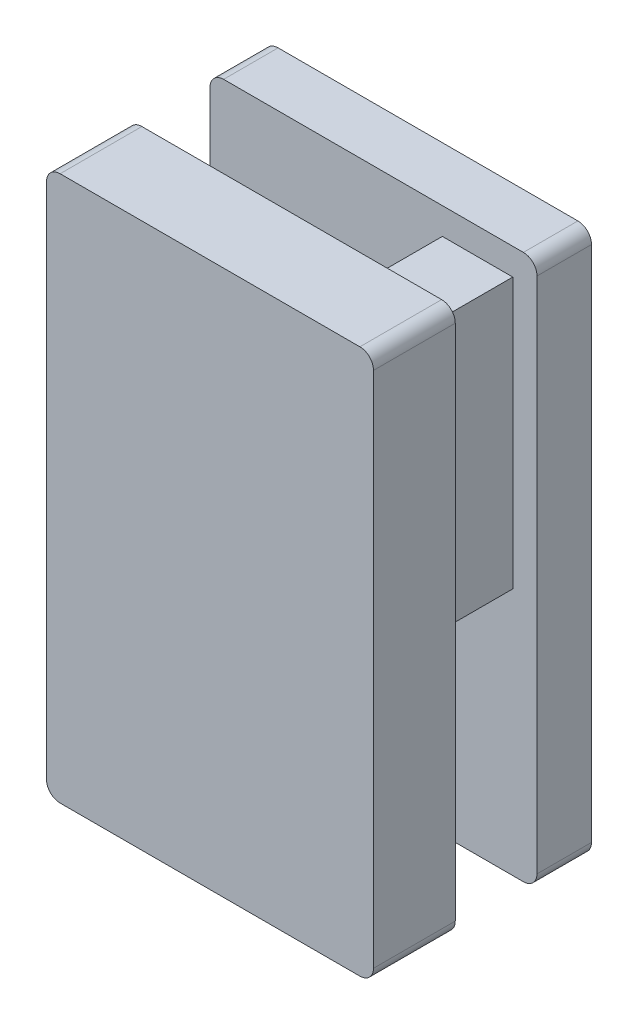
ISO-10303-21;
HEADER;
FILE_DESCRIPTION(('STEP AP214'),'2;1');
FILE_NAME('part.step','',(''),(''),'','','');
FILE_SCHEMA(('AUTOMOTIVE_DESIGN { 1 0 10303 214 1 1 1 1 }'));
ENDSEC;
DATA;
#1=APPLICATION_CONTEXT('core data for automotive mechanical design processes');
#2=APPLICATION_PROTOCOL_DEFINITION('international standard','automotive_design',2000,#1);
#3=PRODUCT_CONTEXT('',#1,'mechanical');
#4=PRODUCT('Part','Part','',(#3));
#5=PRODUCT_RELATED_PRODUCT_CATEGORY('part','',(#4));
#6=PRODUCT_DEFINITION_FORMATION('','',#4);
#7=PRODUCT_DEFINITION_CONTEXT('part definition',#1,'design');
#8=PRODUCT_DEFINITION('design','',#6,#7);
#9=PRODUCT_DEFINITION_SHAPE('','',#8);
#10=(LENGTH_UNIT() NAMED_UNIT(*) SI_UNIT(.MILLI.,.METRE.));
#11=(NAMED_UNIT(*) PLANE_ANGLE_UNIT() SI_UNIT($,.RADIAN.));
#12=(NAMED_UNIT(*) SI_UNIT($,.STERADIAN.) SOLID_ANGLE_UNIT());
#13=UNCERTAINTY_MEASURE_WITH_UNIT(LENGTH_MEASURE(1.E-05),#10,'distance_accuracy_value','');
#14=(GEOMETRIC_REPRESENTATION_CONTEXT(3) GLOBAL_UNCERTAINTY_ASSIGNED_CONTEXT((#13)) GLOBAL_UNIT_ASSIGNED_CONTEXT((#10,
#11,#12)) REPRESENTATION_CONTEXT('',''));
#15=CARTESIAN_POINT('',(0.,0.,0.));
#16=DIRECTION('',(0.,0.,1.));
#17=DIRECTION('',(1.,0.,0.));
#18=AXIS2_PLACEMENT_3D('',#15,#16,#17);
#19=CARTESIAN_POINT('',(0.,0.,2.));
#20=DIRECTION('',(0.,0.,1.));
#21=DIRECTION('',(1.,0.,0.));
#22=AXIS2_PLACEMENT_3D('',#19,#20,#21);
#23=PLANE('',#22);
#24=DIRECTION('',(0.,1.,0.));
#25=VECTOR('',#24,1.);
#26=CARTESIAN_POINT('',(74.5858711935382,-153.,2.));
#27=LINE('',#26,#25);
#28=CARTESIAN_POINT('',(74.5858711935382,-172.5,2.));
#29=VERTEX_POINT('',#28);
#30=CARTESIAN_POINT('',(74.5858711935382,-153.5,2.));
#31=VERTEX_POINT('',#30);
#32=EDGE_CURVE('E218',#29,#31,#27,.T.);
#33=ORIENTED_EDGE('',*,*,#32,.T.);
#34=CARTESIAN_POINT('',(74.0858711935382,-153.5,2.));
#35=DIRECTION('',(0.,0.,1.));
#36=DIRECTION('',(1.,0.,0.));
#37=AXIS2_PLACEMENT_3D('',#34,#35,#36);
#38=CIRCLE('',#37,0.5);
#39=CARTESIAN_POINT('',(74.0858711935382,-153.,2.));
#40=VERTEX_POINT('',#39);
#41=EDGE_CURVE('E282',#31,#40,#38,.T.);
#42=ORIENTED_EDGE('',*,*,#41,.T.);
#43=DIRECTION('',(-1.,0.,0.));
#44=VECTOR('',#43,1.);
#45=CARTESIAN_POINT('',(62.5858711935382,-153.,2.));
#46=LINE('',#45,#44);
#47=CARTESIAN_POINT('',(63.0858711935382,-153.,2.));
#48=VERTEX_POINT('',#47);
#49=EDGE_CURVE('E221',#40,#48,#46,.T.);
#50=ORIENTED_EDGE('',*,*,#49,.T.);
#51=CARTESIAN_POINT('',(63.0858711935382,-153.5,2.));
#52=DIRECTION('',(0.,0.,1.));
#53=DIRECTION('',(1.,0.,0.));
#54=AXIS2_PLACEMENT_3D('',#51,#52,#53);
#55=CIRCLE('',#54,0.5);
#56=CARTESIAN_POINT('',(62.5858711935382,-153.5,2.));
#57=VERTEX_POINT('',#56);
#58=EDGE_CURVE('E280',#48,#57,#55,.T.);
#59=ORIENTED_EDGE('',*,*,#58,.T.);
#60=DIRECTION('',(0.,-1.,0.));
#61=VECTOR('',#60,1.);
#62=CARTESIAN_POINT('',(62.5858711935382,-153.,2.));
#63=LINE('',#62,#61);
#64=CARTESIAN_POINT('',(62.5858711935382,-172.5,2.));
#65=VERTEX_POINT('',#64);
#66=EDGE_CURVE('E213',#57,#65,#63,.T.);
#67=ORIENTED_EDGE('',*,*,#66,.T.);
#68=CARTESIAN_POINT('',(63.0858711935382,-172.5,2.));
#69=DIRECTION('',(0.,0.,1.));
#70=DIRECTION('',(1.,0.,0.));
#71=AXIS2_PLACEMENT_3D('',#68,#69,#70);
#72=CIRCLE('',#71,0.5);
#73=CARTESIAN_POINT('',(63.0858711935382,-173.,2.));
#74=VERTEX_POINT('',#73);
#75=EDGE_CURVE('E52',#65,#74,#72,.T.);
#76=ORIENTED_EDGE('',*,*,#75,.T.);
#77=DIRECTION('',(1.,0.,0.));
#78=VECTOR('',#77,1.);
#79=CARTESIAN_POINT('',(62.5858711935382,-173.,2.));
#80=LINE('',#79,#78);
#81=CARTESIAN_POINT('',(74.0858711935382,-173.,2.));
#82=VERTEX_POINT('',#81);
#83=EDGE_CURVE('E215',#74,#82,#80,.T.);
#84=ORIENTED_EDGE('',*,*,#83,.T.);
#85=CARTESIAN_POINT('',(74.0858711935382,-172.5,2.));
#86=DIRECTION('',(0.,0.,1.));
#87=DIRECTION('',(1.,0.,0.));
#88=AXIS2_PLACEMENT_3D('',#85,#86,#87);
#89=CIRCLE('',#88,0.5);
#90=EDGE_CURVE('E278',#82,#29,#89,.T.);
#91=ORIENTED_EDGE('',*,*,#90,.T.);
#92=EDGE_LOOP('',(#33,#42,#50,#59,#67,#76,#84,#91));
#93=FACE_BOUND('',#92,.T.);
#94=DIRECTION('',(-1.,0.,0.));
#95=VECTOR('',#94,1.);
#96=CARTESIAN_POINT('',(73.6964382759244,-153.978446212882,2.));
#97=LINE('',#96,#95);
#98=CARTESIAN_POINT('',(73.6964382759244,-153.978446212882,2.));
#99=VERTEX_POINT('',#98);
#100=CARTESIAN_POINT('',(71.1128246922588,-153.978446212882,2.));
#101=VERTEX_POINT('',#100);
#102=EDGE_CURVE('E200',#99,#101,#97,.T.);
#103=ORIENTED_EDGE('',*,*,#102,.F.);
#104=DIRECTION('',(0.,1.,0.));
#105=VECTOR('',#104,1.);
#106=CARTESIAN_POINT('',(73.6964382759244,-153.978446212882,2.));
#107=LINE('',#106,#105);
#108=CARTESIAN_POINT('',(73.6964382759244,-163.88819694475,2.));
#109=VERTEX_POINT('',#108);
#110=EDGE_CURVE('E198',#109,#99,#107,.T.);
#111=ORIENTED_EDGE('',*,*,#110,.F.);
#112=DIRECTION('',(1.,0.,0.));
#113=VECTOR('',#112,1.);
#114=CARTESIAN_POINT('',(73.6964382759244,-163.88819694475,2.));
#115=LINE('',#114,#113);
#116=CARTESIAN_POINT('',(71.1128246922588,-163.88819694475,2.));
#117=VERTEX_POINT('',#116);
#118=EDGE_CURVE('E181',#117,#109,#115,.T.);
#119=ORIENTED_EDGE('',*,*,#118,.F.);
#120=DIRECTION('',(0.,-1.,0.));
#121=VECTOR('',#120,1.);
#122=CARTESIAN_POINT('',(71.1128246922588,-153.978446212882,2.));
#123=LINE('',#122,#121);
#124=EDGE_CURVE('E203',#101,#117,#123,.T.);
#125=ORIENTED_EDGE('',*,*,#124,.F.);
#126=EDGE_LOOP('',(#103,#111,#119,#125));
#127=FACE_BOUND('',#126,.T.);
#128=ADVANCED_FACE('F32',(#93,#127),#23,.T.);
#129=CARTESIAN_POINT('',(62.5858711935382,-153.,2.));
#130=DIRECTION('',(1.,0.,0.));
#131=DIRECTION('',(0.,0.,-1.));
#132=AXIS2_PLACEMENT_3D('',#129,#130,#131);
#133=PLANE('',#132);
#134=ORIENTED_EDGE('',*,*,#66,.F.);
#135=DIRECTION('',(0.,0.,-1.));
#136=VECTOR('',#135,1.);
#137=CARTESIAN_POINT('',(62.5858711935382,-153.5,2.));
#138=LINE('',#137,#136);
#139=CARTESIAN_POINT('',(62.5858711935382,-153.5,0.));
#140=VERTEX_POINT('',#139);
#141=EDGE_CURVE('E291',#57,#140,#138,.T.);
#142=ORIENTED_EDGE('',*,*,#141,.T.);
#143=DIRECTION('',(0.,-1.,0.));
#144=VECTOR('',#143,1.);
#145=CARTESIAN_POINT('',(62.5858711935382,-153.,0.));
#146=LINE('',#145,#144);
#147=CARTESIAN_POINT('',(62.5858711935382,-172.5,0.));
#148=VERTEX_POINT('',#147);
#149=EDGE_CURVE('E212',#140,#148,#146,.T.);
#150=ORIENTED_EDGE('',*,*,#149,.T.);
#151=DIRECTION('',(0.,0.,-1.));
#152=VECTOR('',#151,1.);
#153=CARTESIAN_POINT('',(62.5858711935382,-172.5,2.));
#154=LINE('',#153,#152);
#155=EDGE_CURVE('E289',#148,#65,#154,.F.);
#156=ORIENTED_EDGE('',*,*,#155,.T.);
#157=EDGE_LOOP('',(#134,#142,#150,#156));
#158=FACE_BOUND('',#157,.T.);
#159=ADVANCED_FACE('F331',(#158),#133,.F.);
#160=CARTESIAN_POINT('',(62.5858711935382,-173.,2.));
#161=DIRECTION('',(0.,1.,0.));
#162=DIRECTION('',(0.,0.,1.));
#163=AXIS2_PLACEMENT_3D('',#160,#161,#162);
#164=PLANE('',#163);
#165=DIRECTION('',(1.,0.,0.));
#166=VECTOR('',#165,1.);
#167=CARTESIAN_POINT('',(62.5858711935382,-173.,0.));
#168=LINE('',#167,#166);
#169=CARTESIAN_POINT('',(63.0858711935382,-173.,0.));
#170=VERTEX_POINT('',#169);
#171=CARTESIAN_POINT('',(74.0858711935382,-173.,0.));
#172=VERTEX_POINT('',#171);
#173=EDGE_CURVE('E227',#170,#172,#168,.T.);
#174=ORIENTED_EDGE('',*,*,#173,.T.);
#175=DIRECTION('',(0.,0.,-1.));
#176=VECTOR('',#175,1.);
#177=CARTESIAN_POINT('',(74.0858711935382,-173.,2.));
#178=LINE('',#177,#176);
#179=EDGE_CURVE('E11',#172,#82,#178,.F.);
#180=ORIENTED_EDGE('',*,*,#179,.T.);
#181=ORIENTED_EDGE('',*,*,#83,.F.);
#182=DIRECTION('',(0.,0.,-1.));
#183=VECTOR('',#182,1.);
#184=CARTESIAN_POINT('',(63.0858711935382,-173.,2.));
#185=LINE('',#184,#183);
#186=EDGE_CURVE('E40',#74,#170,#185,.T.);
#187=ORIENTED_EDGE('',*,*,#186,.T.);
#188=EDGE_LOOP('',(#174,#180,#181,#187));
#189=FACE_BOUND('',#188,.T.);
#190=ADVANCED_FACE('F301',(#189),#164,.F.);
#191=CARTESIAN_POINT('',(74.5858711935382,-153.,2.));
#192=DIRECTION('',(-1.,0.,0.));
#193=DIRECTION('',(0.,0.,1.));
#194=AXIS2_PLACEMENT_3D('',#191,#192,#193);
#195=PLANE('',#194);
#196=DIRECTION('',(0.,1.,0.));
#197=VECTOR('',#196,1.);
#198=CARTESIAN_POINT('',(74.5858711935382,-153.,0.));
#199=LINE('',#198,#197);
#200=CARTESIAN_POINT('',(74.5858711935382,-172.5,0.));
#201=VERTEX_POINT('',#200);
#202=CARTESIAN_POINT('',(74.5858711935382,-153.5,0.));
#203=VERTEX_POINT('',#202);
#204=EDGE_CURVE('E229',#201,#203,#199,.T.);
#205=ORIENTED_EDGE('',*,*,#204,.T.);
#206=DIRECTION('',(0.,0.,-1.));
#207=VECTOR('',#206,1.);
#208=CARTESIAN_POINT('',(74.5858711935382,-153.5,2.));
#209=LINE('',#208,#207);
#210=EDGE_CURVE('E275',#203,#31,#209,.F.);
#211=ORIENTED_EDGE('',*,*,#210,.T.);
#212=ORIENTED_EDGE('',*,*,#32,.F.);
#213=DIRECTION('',(0.,0.,-1.));
#214=VECTOR('',#213,1.);
#215=CARTESIAN_POINT('',(74.5858711935382,-172.5,2.));
#216=LINE('',#215,#214);
#217=EDGE_CURVE('E272',#29,#201,#216,.T.);
#218=ORIENTED_EDGE('',*,*,#217,.T.);
#219=EDGE_LOOP('',(#205,#211,#212,#218));
#220=FACE_BOUND('',#219,.T.);
#221=ADVANCED_FACE('F314',(#220),#195,.F.);
#222=CARTESIAN_POINT('',(62.5858711935382,-153.,2.));
#223=DIRECTION('',(0.,-1.,0.));
#224=DIRECTION('',(0.,0.,-1.));
#225=AXIS2_PLACEMENT_3D('',#222,#223,#224);
#226=PLANE('',#225);
#227=ORIENTED_EDGE('',*,*,#49,.F.);
#228=DIRECTION('',(0.,0.,-1.));
#229=VECTOR('',#228,1.);
#230=CARTESIAN_POINT('',(74.0858711935382,-153.,2.));
#231=LINE('',#230,#229);
#232=CARTESIAN_POINT('',(74.0858711935382,-153.,0.));
#233=VERTEX_POINT('',#232);
#234=EDGE_CURVE('E261',#40,#233,#231,.T.);
#235=ORIENTED_EDGE('',*,*,#234,.T.);
#236=DIRECTION('',(-1.,0.,0.));
#237=VECTOR('',#236,1.);
#238=CARTESIAN_POINT('',(62.5858711935382,-153.,0.));
#239=LINE('',#238,#237);
#240=CARTESIAN_POINT('',(63.0858711935382,-153.,0.));
#241=VERTEX_POINT('',#240);
#242=EDGE_CURVE('E216',#233,#241,#239,.T.);
#243=ORIENTED_EDGE('',*,*,#242,.T.);
#244=DIRECTION('',(0.,0.,-1.));
#245=VECTOR('',#244,1.);
#246=CARTESIAN_POINT('',(63.0858711935382,-153.,2.));
#247=LINE('',#246,#245);
#248=EDGE_CURVE('E259',#241,#48,#247,.F.);
#249=ORIENTED_EDGE('',*,*,#248,.T.);
#250=EDGE_LOOP('',(#227,#235,#243,#249));
#251=FACE_BOUND('',#250,.T.);
#252=ADVANCED_FACE('F323',(#251),#226,.F.);
#253=CARTESIAN_POINT('',(0.,0.,0.));
#254=DIRECTION('',(0.,0.,1.));
#255=DIRECTION('',(1.,0.,0.));
#256=AXIS2_PLACEMENT_3D('',#253,#254,#255);
#257=PLANE('',#256);
#258=ORIENTED_EDGE('',*,*,#242,.F.);
#259=CARTESIAN_POINT('',(74.0858711935382,-153.5,0.));
#260=DIRECTION('',(0.,0.,1.));
#261=DIRECTION('',(1.,0.,0.));
#262=AXIS2_PLACEMENT_3D('',#259,#260,#261);
#263=CIRCLE('',#262,0.5);
#264=EDGE_CURVE('E270',#233,#203,#263,.F.);
#265=ORIENTED_EDGE('',*,*,#264,.T.);
#266=ORIENTED_EDGE('',*,*,#204,.F.);
#267=CARTESIAN_POINT('',(74.0858711935382,-172.5,0.));
#268=DIRECTION('',(0.,0.,1.));
#269=DIRECTION('',(1.,0.,0.));
#270=AXIS2_PLACEMENT_3D('',#267,#268,#269);
#271=CIRCLE('',#270,0.5);
#272=EDGE_CURVE('E266',#201,#172,#271,.F.);
#273=ORIENTED_EDGE('',*,*,#272,.T.);
#274=ORIENTED_EDGE('',*,*,#173,.F.);
#275=CARTESIAN_POINT('',(63.0858711935382,-172.5,0.));
#276=DIRECTION('',(0.,0.,1.));
#277=DIRECTION('',(1.,0.,0.));
#278=AXIS2_PLACEMENT_3D('',#275,#276,#277);
#279=CIRCLE('',#278,0.5);
#280=EDGE_CURVE('E264',#170,#148,#279,.F.);
#281=ORIENTED_EDGE('',*,*,#280,.T.);
#282=ORIENTED_EDGE('',*,*,#149,.F.);
#283=CARTESIAN_POINT('',(63.0858711935382,-153.5,0.));
#284=DIRECTION('',(0.,0.,1.));
#285=DIRECTION('',(1.,0.,0.));
#286=AXIS2_PLACEMENT_3D('',#283,#284,#285);
#287=CIRCLE('',#286,0.5);
#288=EDGE_CURVE('E268',#140,#241,#287,.F.);
#289=ORIENTED_EDGE('',*,*,#288,.T.);
#290=EDGE_LOOP('',(#258,#265,#266,#273,#274,#281,#282,#289));
#291=FACE_BOUND('',#290,.T.);
#292=ADVANCED_FACE('F305',(#291),#257,.F.);
#293=CARTESIAN_POINT('',(73.6964382759244,-153.978446212882,5.));
#294=DIRECTION('',(-1.,0.,0.));
#295=DIRECTION('',(0.,0.,1.));
#296=AXIS2_PLACEMENT_3D('',#293,#294,#295);
#297=PLANE('',#296);
#298=ORIENTED_EDGE('',*,*,#110,.T.);
#299=DIRECTION('',(0.,0.,-1.));
#300=VECTOR('',#299,1.);
#301=CARTESIAN_POINT('',(73.6964382759244,-153.978446212882,5.));
#302=LINE('',#301,#300);
#303=CARTESIAN_POINT('',(73.6964382759244,-153.978446212882,5.));
#304=VERTEX_POINT('',#303);
#305=EDGE_CURVE('E176',#304,#99,#302,.T.);
#306=ORIENTED_EDGE('',*,*,#305,.F.);
#307=DIRECTION('',(0.,1.,0.));
#308=VECTOR('',#307,1.);
#309=CARTESIAN_POINT('',(73.6964382759244,-153.978446212882,5.));
#310=LINE('',#309,#308);
#311=CARTESIAN_POINT('',(73.6964382759244,-163.88819694475,5.));
#312=VERTEX_POINT('',#311);
#313=EDGE_CURVE('E170',#312,#304,#310,.T.);
#314=ORIENTED_EDGE('',*,*,#313,.F.);
#315=DIRECTION('',(0.,0.,-1.));
#316=VECTOR('',#315,1.);
#317=CARTESIAN_POINT('',(73.6964382759244,-163.88819694475,5.));
#318=LINE('',#317,#316);
#319=EDGE_CURVE('E174',#312,#109,#318,.T.);
#320=ORIENTED_EDGE('',*,*,#319,.T.);
#321=EDGE_LOOP('',(#298,#306,#314,#320));
#322=FACE_BOUND('',#321,.T.);
#323=ADVANCED_FACE('F173',(#322),#297,.F.);
#324=CARTESIAN_POINT('',(73.6964382759244,-153.978446212882,5.));
#325=DIRECTION('',(0.,-1.,0.));
#326=DIRECTION('',(0.,0.,-1.));
#327=AXIS2_PLACEMENT_3D('',#324,#325,#326);
#328=PLANE('',#327);
#329=ORIENTED_EDGE('',*,*,#102,.T.);
#330=DIRECTION('',(0.,0.,-1.));
#331=VECTOR('',#330,1.);
#332=CARTESIAN_POINT('',(71.1128246922588,-153.978446212882,5.));
#333=LINE('',#332,#331);
#334=CARTESIAN_POINT('',(71.1128246922588,-153.978446212882,5.));
#335=VERTEX_POINT('',#334);
#336=EDGE_CURVE('E208',#335,#101,#333,.T.);
#337=ORIENTED_EDGE('',*,*,#336,.F.);
#338=DIRECTION('',(-1.,0.,0.));
#339=VECTOR('',#338,1.);
#340=CARTESIAN_POINT('',(73.6964382759244,-153.978446212882,5.));
#341=LINE('',#340,#339);
#342=EDGE_CURVE('E180',#304,#335,#341,.T.);
#343=ORIENTED_EDGE('',*,*,#342,.F.);
#344=ORIENTED_EDGE('',*,*,#305,.T.);
#345=EDGE_LOOP('',(#329,#337,#343,#344));
#346=FACE_BOUND('',#345,.T.);
#347=ADVANCED_FACE('F411',(#346),#328,.F.);
#348=CARTESIAN_POINT('',(71.1128246922588,-153.978446212882,5.));
#349=DIRECTION('',(1.,0.,0.));
#350=DIRECTION('',(0.,0.,-1.));
#351=AXIS2_PLACEMENT_3D('',#348,#349,#350);
#352=PLANE('',#351);
#353=ORIENTED_EDGE('',*,*,#124,.T.);
#354=DIRECTION('',(0.,0.,-1.));
#355=VECTOR('',#354,1.);
#356=CARTESIAN_POINT('',(71.1128246922588,-163.88819694475,5.));
#357=LINE('',#356,#355);
#358=CARTESIAN_POINT('',(71.1128246922588,-163.88819694475,5.));
#359=VERTEX_POINT('',#358);
#360=EDGE_CURVE('E189',#359,#117,#357,.T.);
#361=ORIENTED_EDGE('',*,*,#360,.F.);
#362=DIRECTION('',(0.,-1.,0.));
#363=VECTOR('',#362,1.);
#364=CARTESIAN_POINT('',(71.1128246922588,-153.978446212882,5.));
#365=LINE('',#364,#363);
#366=EDGE_CURVE('E193',#335,#359,#365,.T.);
#367=ORIENTED_EDGE('',*,*,#366,.F.);
#368=ORIENTED_EDGE('',*,*,#336,.T.);
#369=EDGE_LOOP('',(#353,#361,#367,#368));
#370=FACE_BOUND('',#369,.T.);
#371=ADVANCED_FACE('F415',(#370),#352,.F.);
#372=CARTESIAN_POINT('',(73.6964382759244,-163.88819694475,5.));
#373=DIRECTION('',(0.,1.,0.));
#374=DIRECTION('',(0.,0.,1.));
#375=AXIS2_PLACEMENT_3D('',#372,#373,#374);
#376=PLANE('',#375);
#377=ORIENTED_EDGE('',*,*,#118,.T.);
#378=ORIENTED_EDGE('',*,*,#319,.F.);
#379=DIRECTION('',(1.,0.,0.));
#380=VECTOR('',#379,1.);
#381=CARTESIAN_POINT('',(73.6964382759244,-163.88819694475,5.));
#382=LINE('',#381,#380);
#383=EDGE_CURVE('E186',#359,#312,#382,.T.);
#384=ORIENTED_EDGE('',*,*,#383,.F.);
#385=ORIENTED_EDGE('',*,*,#360,.T.);
#386=EDGE_LOOP('',(#377,#378,#384,#385));
#387=FACE_BOUND('',#386,.T.);
#388=ADVANCED_FACE('F185',(#387),#376,.F.);
#389=CARTESIAN_POINT('',(0.,0.,5.));
#390=DIRECTION('',(0.,0.,1.));
#391=DIRECTION('',(1.,0.,0.));
#392=AXIS2_PLACEMENT_3D('',#389,#390,#391);
#393=PLANE('',#392);
#394=DIRECTION('',(-1.,0.,0.));
#395=VECTOR('',#394,1.);
#396=CARTESIAN_POINT('',(74.5858711935382,-153.,5.));
#397=LINE('',#396,#395);
#398=CARTESIAN_POINT('',(74.0858711935382,-153.,5.));
#399=VERTEX_POINT('',#398);
#400=CARTESIAN_POINT('',(63.0858711935382,-153.,5.));
#401=VERTEX_POINT('',#400);
#402=EDGE_CURVE('E406',#399,#401,#397,.T.);
#403=ORIENTED_EDGE('',*,*,#402,.F.);
#404=CARTESIAN_POINT('',(74.0858711935382,-153.5,5.));
#405=DIRECTION('',(0.,0.,1.));
#406=DIRECTION('',(1.,0.,0.));
#407=AXIS2_PLACEMENT_3D('',#404,#405,#406);
#408=CIRCLE('',#407,0.5);
#409=CARTESIAN_POINT('',(74.5858711935382,-153.5,5.));
#410=VERTEX_POINT('',#409);
#411=EDGE_CURVE('E244',#399,#410,#408,.F.);
#412=ORIENTED_EDGE('',*,*,#411,.T.);
#413=DIRECTION('',(0.,1.,0.));
#414=VECTOR('',#413,1.);
#415=CARTESIAN_POINT('',(74.5858711935382,-173.,5.));
#416=LINE('',#415,#414);
#417=CARTESIAN_POINT('',(74.5858711935382,-172.5,5.));
#418=VERTEX_POINT('',#417);
#419=EDGE_CURVE('E404',#418,#410,#416,.T.);
#420=ORIENTED_EDGE('',*,*,#419,.F.);
#421=CARTESIAN_POINT('',(74.0858711935382,-172.5,5.));
#422=DIRECTION('',(0.,0.,1.));
#423=DIRECTION('',(1.,0.,0.));
#424=AXIS2_PLACEMENT_3D('',#421,#422,#423);
#425=CIRCLE('',#424,0.5);
#426=CARTESIAN_POINT('',(74.0858711935382,-173.,5.));
#427=VERTEX_POINT('',#426);
#428=EDGE_CURVE('E238',#418,#427,#425,.F.);
#429=ORIENTED_EDGE('',*,*,#428,.T.);
#430=DIRECTION('',(1.,0.,0.));
#431=VECTOR('',#430,1.);
#432=CARTESIAN_POINT('',(62.5858711935382,-173.,5.));
#433=LINE('',#432,#431);
#434=CARTESIAN_POINT('',(63.0858711935382,-173.,5.));
#435=VERTEX_POINT('',#434);
#436=EDGE_CURVE('E401',#435,#427,#433,.T.);
#437=ORIENTED_EDGE('',*,*,#436,.F.);
#438=CARTESIAN_POINT('',(63.0858711935382,-172.5,5.));
#439=DIRECTION('',(0.,0.,1.));
#440=DIRECTION('',(1.,0.,0.));
#441=AXIS2_PLACEMENT_3D('',#438,#439,#440);
#442=CIRCLE('',#441,0.5);
#443=CARTESIAN_POINT('',(62.5858711935382,-172.5,5.));
#444=VERTEX_POINT('',#443);
#445=EDGE_CURVE('E240',#435,#444,#442,.F.);
#446=ORIENTED_EDGE('',*,*,#445,.T.);
#447=DIRECTION('',(0.,-1.,0.));
#448=VECTOR('',#447,1.);
#449=CARTESIAN_POINT('',(62.5858711935382,-153.,5.));
#450=LINE('',#449,#448);
#451=CARTESIAN_POINT('',(62.5858711935382,-153.5,5.));
#452=VERTEX_POINT('',#451);
#453=EDGE_CURVE('E396',#452,#444,#450,.T.);
#454=ORIENTED_EDGE('',*,*,#453,.F.);
#455=CARTESIAN_POINT('',(63.0858711935382,-153.5,5.));
#456=DIRECTION('',(0.,0.,1.));
#457=DIRECTION('',(1.,0.,0.));
#458=AXIS2_PLACEMENT_3D('',#455,#456,#457);
#459=CIRCLE('',#458,0.5);
#460=EDGE_CURVE('E242',#452,#401,#459,.F.);
#461=ORIENTED_EDGE('',*,*,#460,.T.);
#462=EDGE_LOOP('',(#403,#412,#420,#429,#437,#446,#454,#461));
#463=FACE_BOUND('',#462,.T.);
#464=ORIENTED_EDGE('',*,*,#383,.T.);
#465=ORIENTED_EDGE('',*,*,#313,.T.);
#466=ORIENTED_EDGE('',*,*,#342,.T.);
#467=ORIENTED_EDGE('',*,*,#366,.T.);
#468=EDGE_LOOP('',(#464,#465,#466,#467));
#469=FACE_BOUND('',#468,.T.);
#470=ADVANCED_FACE('F191',(#463,#469),#393,.F.);
#471=CARTESIAN_POINT('',(62.5858711935382,-173.,8.));
#472=DIRECTION('',(0.,1.,0.));
#473=DIRECTION('',(0.,0.,1.));
#474=AXIS2_PLACEMENT_3D('',#471,#472,#473);
#475=PLANE('',#474);
#476=DIRECTION('',(1.,0.,0.));
#477=VECTOR('',#476,1.);
#478=CARTESIAN_POINT('',(62.5858711935382,-173.,8.));
#479=LINE('',#478,#477);
#480=CARTESIAN_POINT('',(63.0858711935382,-173.,8.));
#481=VERTEX_POINT('',#480);
#482=CARTESIAN_POINT('',(74.0858711935382,-173.,8.));
#483=VERTEX_POINT('',#482);
#484=EDGE_CURVE('E386',#481,#483,#479,.T.);
#485=ORIENTED_EDGE('',*,*,#484,.F.);
#486=DIRECTION('',(0.,0.,-1.));
#487=VECTOR('',#486,1.);
#488=CARTESIAN_POINT('',(63.0858711935382,-173.,8.));
#489=LINE('',#488,#487);
#490=EDGE_CURVE('E296',#481,#435,#489,.T.);
#491=ORIENTED_EDGE('',*,*,#490,.T.);
#492=ORIENTED_EDGE('',*,*,#436,.T.);
#493=DIRECTION('',(0.,0.,-1.));
#494=VECTOR('',#493,1.);
#495=CARTESIAN_POINT('',(74.0858711935382,-173.,8.));
#496=LINE('',#495,#494);
#497=EDGE_CURVE('E294',#427,#483,#496,.F.);
#498=ORIENTED_EDGE('',*,*,#497,.T.);
#499=EDGE_LOOP('',(#485,#491,#492,#498));
#500=FACE_BOUND('',#499,.T.);
#501=ADVANCED_FACE('F424',(#500),#475,.F.);
#502=CARTESIAN_POINT('',(74.5858711935382,-173.,8.));
#503=DIRECTION('',(-1.,0.,0.));
#504=DIRECTION('',(0.,0.,1.));
#505=AXIS2_PLACEMENT_3D('',#502,#503,#504);
#506=PLANE('',#505);
#507=ORIENTED_EDGE('',*,*,#419,.T.);
#508=DIRECTION('',(0.,0.,-1.));
#509=VECTOR('',#508,1.);
#510=CARTESIAN_POINT('',(74.5858711935382,-153.5,8.));
#511=LINE('',#510,#509);
#512=CARTESIAN_POINT('',(74.5858711935382,-153.5,8.));
#513=VERTEX_POINT('',#512);
#514=EDGE_CURVE('E249',#410,#513,#511,.F.);
#515=ORIENTED_EDGE('',*,*,#514,.T.);
#516=DIRECTION('',(0.,1.,0.));
#517=VECTOR('',#516,1.);
#518=CARTESIAN_POINT('',(74.5858711935382,-173.,8.));
#519=LINE('',#518,#517);
#520=CARTESIAN_POINT('',(74.5858711935382,-172.5,8.));
#521=VERTEX_POINT('',#520);
#522=EDGE_CURVE('E383',#521,#513,#519,.T.);
#523=ORIENTED_EDGE('',*,*,#522,.F.);
#524=DIRECTION('',(0.,0.,-1.));
#525=VECTOR('',#524,1.);
#526=CARTESIAN_POINT('',(74.5858711935382,-172.5,8.));
#527=LINE('',#526,#525);
#528=EDGE_CURVE('E246',#521,#418,#527,.T.);
#529=ORIENTED_EDGE('',*,*,#528,.T.);
#530=EDGE_LOOP('',(#507,#515,#523,#529));
#531=FACE_BOUND('',#530,.T.);
#532=ADVANCED_FACE('F389',(#531),#506,.F.);
#533=CARTESIAN_POINT('',(74.5858711935382,-153.,8.));
#534=DIRECTION('',(0.,-1.,0.));
#535=DIRECTION('',(0.,0.,-1.));
#536=AXIS2_PLACEMENT_3D('',#533,#534,#535);
#537=PLANE('',#536);
#538=DIRECTION('',(-1.,0.,0.));
#539=VECTOR('',#538,1.);
#540=CARTESIAN_POINT('',(74.5858711935382,-153.,8.));
#541=LINE('',#540,#539);
#542=CARTESIAN_POINT('',(74.0858711935382,-153.,8.));
#543=VERTEX_POINT('',#542);
#544=CARTESIAN_POINT('',(63.0858711935382,-153.,8.));
#545=VERTEX_POINT('',#544);
#546=EDGE_CURVE('E392',#543,#545,#541,.T.);
#547=ORIENTED_EDGE('',*,*,#546,.F.);
#548=DIRECTION('',(0.,0.,-1.));
#549=VECTOR('',#548,1.);
#550=CARTESIAN_POINT('',(74.0858711935382,-153.,8.));
#551=LINE('',#550,#549);
#552=EDGE_CURVE('E235',#543,#399,#551,.T.);
#553=ORIENTED_EDGE('',*,*,#552,.T.);
#554=ORIENTED_EDGE('',*,*,#402,.T.);
#555=DIRECTION('',(0.,0.,-1.));
#556=VECTOR('',#555,1.);
#557=CARTESIAN_POINT('',(63.0858711935382,-153.,8.));
#558=LINE('',#557,#556);
#559=EDGE_CURVE('E224',#401,#545,#558,.F.);
#560=ORIENTED_EDGE('',*,*,#559,.T.);
#561=EDGE_LOOP('',(#547,#553,#554,#560));
#562=FACE_BOUND('',#561,.T.);
#563=ADVANCED_FACE('F430',(#562),#537,.F.);
#564=CARTESIAN_POINT('',(62.5858711935382,-153.,8.));
#565=DIRECTION('',(1.,0.,0.));
#566=DIRECTION('',(0.,0.,-1.));
#567=AXIS2_PLACEMENT_3D('',#564,#565,#566);
#568=PLANE('',#567);
#569=DIRECTION('',(0.,-1.,0.));
#570=VECTOR('',#569,1.);
#571=CARTESIAN_POINT('',(62.5858711935382,-153.,8.));
#572=LINE('',#571,#570);
#573=CARTESIAN_POINT('',(62.5858711935382,-153.5,8.));
#574=VERTEX_POINT('',#573);
#575=CARTESIAN_POINT('',(62.5858711935382,-172.5,8.));
#576=VERTEX_POINT('',#575);
#577=EDGE_CURVE('E201',#574,#576,#572,.T.);
#578=ORIENTED_EDGE('',*,*,#577,.F.);
#579=DIRECTION('',(0.,0.,-1.));
#580=VECTOR('',#579,1.);
#581=CARTESIAN_POINT('',(62.5858711935382,-153.5,8.));
#582=LINE('',#581,#580);
#583=EDGE_CURVE('E286',#574,#452,#582,.T.);
#584=ORIENTED_EDGE('',*,*,#583,.T.);
#585=ORIENTED_EDGE('',*,*,#453,.T.);
#586=DIRECTION('',(0.,0.,-1.));
#587=VECTOR('',#586,1.);
#588=CARTESIAN_POINT('',(62.5858711935382,-172.5,8.));
#589=LINE('',#588,#587);
#590=EDGE_CURVE('E284',#444,#576,#589,.F.);
#591=ORIENTED_EDGE('',*,*,#590,.T.);
#592=EDGE_LOOP('',(#578,#584,#585,#591));
#593=FACE_BOUND('',#592,.T.);
#594=ADVANCED_FACE('F433',(#593),#568,.F.);
#595=CARTESIAN_POINT('',(0.,0.,8.));
#596=DIRECTION('',(0.,0.,1.));
#597=DIRECTION('',(1.,0.,0.));
#598=AXIS2_PLACEMENT_3D('',#595,#596,#597);
#599=PLANE('',#598);
#600=ORIENTED_EDGE('',*,*,#522,.T.);
#601=CARTESIAN_POINT('',(74.0858711935382,-153.5,8.));
#602=DIRECTION('',(0.,0.,1.));
#603=DIRECTION('',(1.,0.,0.));
#604=AXIS2_PLACEMENT_3D('',#601,#602,#603);
#605=CIRCLE('',#604,0.5);
#606=EDGE_CURVE('E257',#513,#543,#605,.T.);
#607=ORIENTED_EDGE('',*,*,#606,.T.);
#608=ORIENTED_EDGE('',*,*,#546,.T.);
#609=CARTESIAN_POINT('',(63.0858711935382,-153.5,8.));
#610=DIRECTION('',(0.,0.,1.));
#611=DIRECTION('',(1.,0.,0.));
#612=AXIS2_PLACEMENT_3D('',#609,#610,#611);
#613=CIRCLE('',#612,0.5);
#614=EDGE_CURVE('E255',#545,#574,#613,.T.);
#615=ORIENTED_EDGE('',*,*,#614,.T.);
#616=ORIENTED_EDGE('',*,*,#577,.T.);
#617=CARTESIAN_POINT('',(63.0858711935382,-172.5,8.));
#618=DIRECTION('',(0.,0.,1.));
#619=DIRECTION('',(1.,0.,0.));
#620=AXIS2_PLACEMENT_3D('',#617,#618,#619);
#621=CIRCLE('',#620,0.5);
#622=EDGE_CURVE('E253',#576,#481,#621,.T.);
#623=ORIENTED_EDGE('',*,*,#622,.T.);
#624=ORIENTED_EDGE('',*,*,#484,.T.);
#625=CARTESIAN_POINT('',(74.0858711935382,-172.5,8.));
#626=DIRECTION('',(0.,0.,1.));
#627=DIRECTION('',(1.,0.,0.));
#628=AXIS2_PLACEMENT_3D('',#625,#626,#627);
#629=CIRCLE('',#628,0.5);
#630=EDGE_CURVE('E251',#483,#521,#629,.T.);
#631=ORIENTED_EDGE('',*,*,#630,.T.);
#632=EDGE_LOOP('',(#600,#607,#608,#615,#616,#623,#624,#631));
#633=FACE_BOUND('',#632,.T.);
#634=ADVANCED_FACE('F358',(#633),#599,.T.);
#635=CARTESIAN_POINT('',(74.0858711935382,-153.5,8.));
#636=DIRECTION('',(0.,0.,-1.));
#637=DIRECTION('',(-1.,0.,0.));
#638=AXIS2_PLACEMENT_3D('',#635,#636,#637);
#639=CYLINDRICAL_SURFACE('',#638,0.5);
#640=ORIENTED_EDGE('',*,*,#606,.F.);
#641=ORIENTED_EDGE('',*,*,#514,.F.);
#642=ORIENTED_EDGE('',*,*,#411,.F.);
#643=ORIENTED_EDGE('',*,*,#552,.F.);
#644=EDGE_LOOP('',(#640,#641,#642,#643));
#645=FACE_BOUND('',#644,.T.);
#646=ADVANCED_FACE('F355',(#645),#639,.T.);
#647=CARTESIAN_POINT('',(74.0858711935382,-153.5,2.));
#648=DIRECTION('',(0.,0.,-1.));
#649=DIRECTION('',(-1.,0.,0.));
#650=AXIS2_PLACEMENT_3D('',#647,#648,#649);
#651=CYLINDRICAL_SURFACE('',#650,0.5);
#652=ORIENTED_EDGE('',*,*,#41,.F.);
#653=ORIENTED_EDGE('',*,*,#210,.F.);
#654=ORIENTED_EDGE('',*,*,#264,.F.);
#655=ORIENTED_EDGE('',*,*,#234,.F.);
#656=EDGE_LOOP('',(#652,#653,#654,#655));
#657=FACE_BOUND('',#656,.T.);
#658=ADVANCED_FACE('F321',(#657),#651,.T.);
#659=CARTESIAN_POINT('',(63.0858711935382,-153.5,8.));
#660=DIRECTION('',(0.,0.,-1.));
#661=DIRECTION('',(-1.,0.,0.));
#662=AXIS2_PLACEMENT_3D('',#659,#660,#661);
#663=CYLINDRICAL_SURFACE('',#662,0.5);
#664=ORIENTED_EDGE('',*,*,#614,.F.);
#665=ORIENTED_EDGE('',*,*,#559,.F.);
#666=ORIENTED_EDGE('',*,*,#460,.F.);
#667=ORIENTED_EDGE('',*,*,#583,.F.);
#668=EDGE_LOOP('',(#664,#665,#666,#667));
#669=FACE_BOUND('',#668,.T.);
#670=ADVANCED_FACE('F362',(#669),#663,.T.);
#671=CARTESIAN_POINT('',(63.0858711935382,-153.5,2.));
#672=DIRECTION('',(0.,0.,-1.));
#673=DIRECTION('',(-1.,0.,0.));
#674=AXIS2_PLACEMENT_3D('',#671,#672,#673);
#675=CYLINDRICAL_SURFACE('',#674,0.5);
#676=ORIENTED_EDGE('',*,*,#58,.F.);
#677=ORIENTED_EDGE('',*,*,#248,.F.);
#678=ORIENTED_EDGE('',*,*,#288,.F.);
#679=ORIENTED_EDGE('',*,*,#141,.F.);
#680=EDGE_LOOP('',(#676,#677,#678,#679));
#681=FACE_BOUND('',#680,.T.);
#682=ADVANCED_FACE('F328',(#681),#675,.T.);
#683=CARTESIAN_POINT('',(63.0858711935382,-172.5,8.));
#684=DIRECTION('',(0.,0.,-1.));
#685=DIRECTION('',(-1.,0.,0.));
#686=AXIS2_PLACEMENT_3D('',#683,#684,#685);
#687=CYLINDRICAL_SURFACE('',#686,0.5);
#688=ORIENTED_EDGE('',*,*,#622,.F.);
#689=ORIENTED_EDGE('',*,*,#590,.F.);
#690=ORIENTED_EDGE('',*,*,#445,.F.);
#691=ORIENTED_EDGE('',*,*,#490,.F.);
#692=EDGE_LOOP('',(#688,#689,#690,#691));
#693=FACE_BOUND('',#692,.T.);
#694=ADVANCED_FACE('F368',(#693),#687,.T.);
#695=CARTESIAN_POINT('',(74.0858711935382,-172.5,8.));
#696=DIRECTION('',(0.,0.,-1.));
#697=DIRECTION('',(-1.,0.,0.));
#698=AXIS2_PLACEMENT_3D('',#695,#696,#697);
#699=CYLINDRICAL_SURFACE('',#698,0.5);
#700=ORIENTED_EDGE('',*,*,#630,.F.);
#701=ORIENTED_EDGE('',*,*,#497,.F.);
#702=ORIENTED_EDGE('',*,*,#428,.F.);
#703=ORIENTED_EDGE('',*,*,#528,.F.);
#704=EDGE_LOOP('',(#700,#701,#702,#703));
#705=FACE_BOUND('',#704,.T.);
#706=ADVANCED_FACE('F337',(#705),#699,.T.);
#707=CARTESIAN_POINT('',(74.0858711935382,-172.5,2.));
#708=DIRECTION('',(0.,0.,-1.));
#709=DIRECTION('',(-1.,0.,0.));
#710=AXIS2_PLACEMENT_3D('',#707,#708,#709);
#711=CYLINDRICAL_SURFACE('',#710,0.5);
#712=ORIENTED_EDGE('',*,*,#90,.F.);
#713=ORIENTED_EDGE('',*,*,#179,.F.);
#714=ORIENTED_EDGE('',*,*,#272,.F.);
#715=ORIENTED_EDGE('',*,*,#217,.F.);
#716=EDGE_LOOP('',(#712,#713,#714,#715));
#717=FACE_BOUND('',#716,.T.);
#718=ADVANCED_FACE('F311',(#717),#711,.T.);
#719=CARTESIAN_POINT('',(63.0858711935382,-172.5,2.));
#720=DIRECTION('',(0.,0.,-1.));
#721=DIRECTION('',(-1.,0.,0.));
#722=AXIS2_PLACEMENT_3D('',#719,#720,#721);
#723=CYLINDRICAL_SURFACE('',#722,0.5);
#724=ORIENTED_EDGE('',*,*,#75,.F.);
#725=ORIENTED_EDGE('',*,*,#155,.F.);
#726=ORIENTED_EDGE('',*,*,#280,.F.);
#727=ORIENTED_EDGE('',*,*,#186,.F.);
#728=EDGE_LOOP('',(#724,#725,#726,#727));
#729=FACE_BOUND('',#728,.T.);
#730=ADVANCED_FACE('F34',(#729),#723,.T.);
#731=CLOSED_SHELL('',(#128,#159,#190,#221,#252,#292,#323,#347,#371,#388,#470,#501,#532,#563,
#594,#634,#646,#658,#670,#682,#694,#706,#718,#730));
#732=MANIFOLD_SOLID_BREP('B2',#731);
#733=ADVANCED_BREP_SHAPE_REPRESENTATION('',(#18,#732),#14);
#734=SHAPE_DEFINITION_REPRESENTATION(#9,#733);
ENDSEC;
END-ISO-10303-21;
